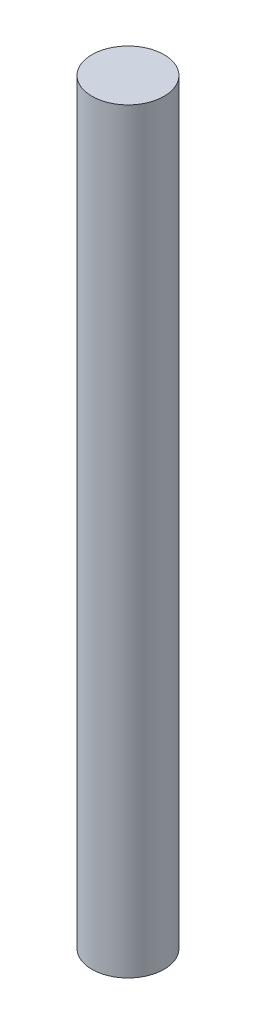
ISO-10303-21;
HEADER;
FILE_DESCRIPTION(('STEP AP214'),'2;1');
FILE_NAME('part.step','',(''),(''),'','','');
FILE_SCHEMA(('AUTOMOTIVE_DESIGN { 1 0 10303 214 1 1 1 1 }'));
ENDSEC;
DATA;
#1=APPLICATION_CONTEXT('core data for automotive mechanical design processes');
#2=APPLICATION_PROTOCOL_DEFINITION('international standard','automotive_design',2000,#1);
#3=PRODUCT_CONTEXT('',#1,'mechanical');
#4=PRODUCT('Part','Part','',(#3));
#5=PRODUCT_RELATED_PRODUCT_CATEGORY('part','',(#4));
#6=PRODUCT_DEFINITION_FORMATION('','',#4);
#7=PRODUCT_DEFINITION_CONTEXT('part definition',#1,'design');
#8=PRODUCT_DEFINITION('design','',#6,#7);
#9=PRODUCT_DEFINITION_SHAPE('','',#8);
#10=(LENGTH_UNIT() NAMED_UNIT(*) SI_UNIT(.MILLI.,.METRE.));
#11=(NAMED_UNIT(*) PLANE_ANGLE_UNIT() SI_UNIT($,.RADIAN.));
#12=(NAMED_UNIT(*) SI_UNIT($,.STERADIAN.) SOLID_ANGLE_UNIT());
#13=UNCERTAINTY_MEASURE_WITH_UNIT(LENGTH_MEASURE(1.E-05),#10,'distance_accuracy_value','');
#14=(GEOMETRIC_REPRESENTATION_CONTEXT(3) GLOBAL_UNCERTAINTY_ASSIGNED_CONTEXT((#13)) GLOBAL_UNIT_ASSIGNED_CONTEXT((#10,
#11,#12)) REPRESENTATION_CONTEXT('',''));
#15=CARTESIAN_POINT('',(0.,0.,0.));
#16=DIRECTION('',(0.,0.,1.));
#17=DIRECTION('',(1.,0.,0.));
#18=AXIS2_PLACEMENT_3D('',#15,#16,#17);
#19=CARTESIAN_POINT('',(0.,350.,0.));
#20=DIRECTION('',(0.,-1.,0.));
#21=DIRECTION('',(0.,0.,-1.));
#22=AXIS2_PLACEMENT_3D('',#19,#20,#21);
#23=CYLINDRICAL_SURFACE('',#22,16.7);
#24=CARTESIAN_POINT('',(0.,350.,0.));
#25=DIRECTION('',(0.,1.,0.));
#26=DIRECTION('',(0.,0.,1.));
#27=AXIS2_PLACEMENT_3D('',#24,#25,#26);
#28=CIRCLE('',#27,16.7);
#29=CARTESIAN_POINT('',(0.,350.,16.7));
#30=VERTEX_POINT('',#29);
#31=EDGE_CURVE('E10',#30,#30,#28,.T.);
#32=ORIENTED_EDGE('',*,*,#31,.F.);
#33=EDGE_LOOP('',(#32));
#34=FACE_BOUND('',#33,.T.);
#35=CARTESIAN_POINT('',(0.,0.,0.));
#36=DIRECTION('',(0.,1.,0.));
#37=DIRECTION('',(0.,0.,1.));
#38=AXIS2_PLACEMENT_3D('',#35,#36,#37);
#39=CIRCLE('',#38,16.7);
#40=CARTESIAN_POINT('',(0.,0.,16.7));
#41=VERTEX_POINT('',#40);
#42=EDGE_CURVE('E36',#41,#41,#39,.T.);
#43=ORIENTED_EDGE('',*,*,#42,.T.);
#44=EDGE_LOOP('',(#43));
#45=FACE_BOUND('',#44,.T.);
#46=ADVANCED_FACE('F33',(#34,#45),#23,.T.);
#47=CARTESIAN_POINT('',(0.,350.,0.));
#48=DIRECTION('',(0.,1.,0.));
#49=DIRECTION('',(0.,0.,1.));
#50=AXIS2_PLACEMENT_3D('',#47,#48,#49);
#51=PLANE('',#50);
#52=ORIENTED_EDGE('',*,*,#31,.T.);
#53=EDGE_LOOP('',(#52));
#54=FACE_BOUND('',#53,.T.);
#55=ADVANCED_FACE('F48',(#54),#51,.T.);
#56=CARTESIAN_POINT('',(0.,0.,0.));
#57=DIRECTION('',(0.,1.,0.));
#58=DIRECTION('',(0.,0.,1.));
#59=AXIS2_PLACEMENT_3D('',#56,#57,#58);
#60=PLANE('',#59);
#61=ORIENTED_EDGE('',*,*,#42,.F.);
#62=EDGE_LOOP('',(#61));
#63=FACE_BOUND('',#62,.T.);
#64=ADVANCED_FACE('F46',(#63),#60,.F.);
#65=CLOSED_SHELL('',(#46,#55,#64));
#66=MANIFOLD_SOLID_BREP('B2',#65);
#67=ADVANCED_BREP_SHAPE_REPRESENTATION('',(#18,#66),#14);
#68=SHAPE_DEFINITION_REPRESENTATION(#9,#67);
ENDSEC;
END-ISO-10303-21;
